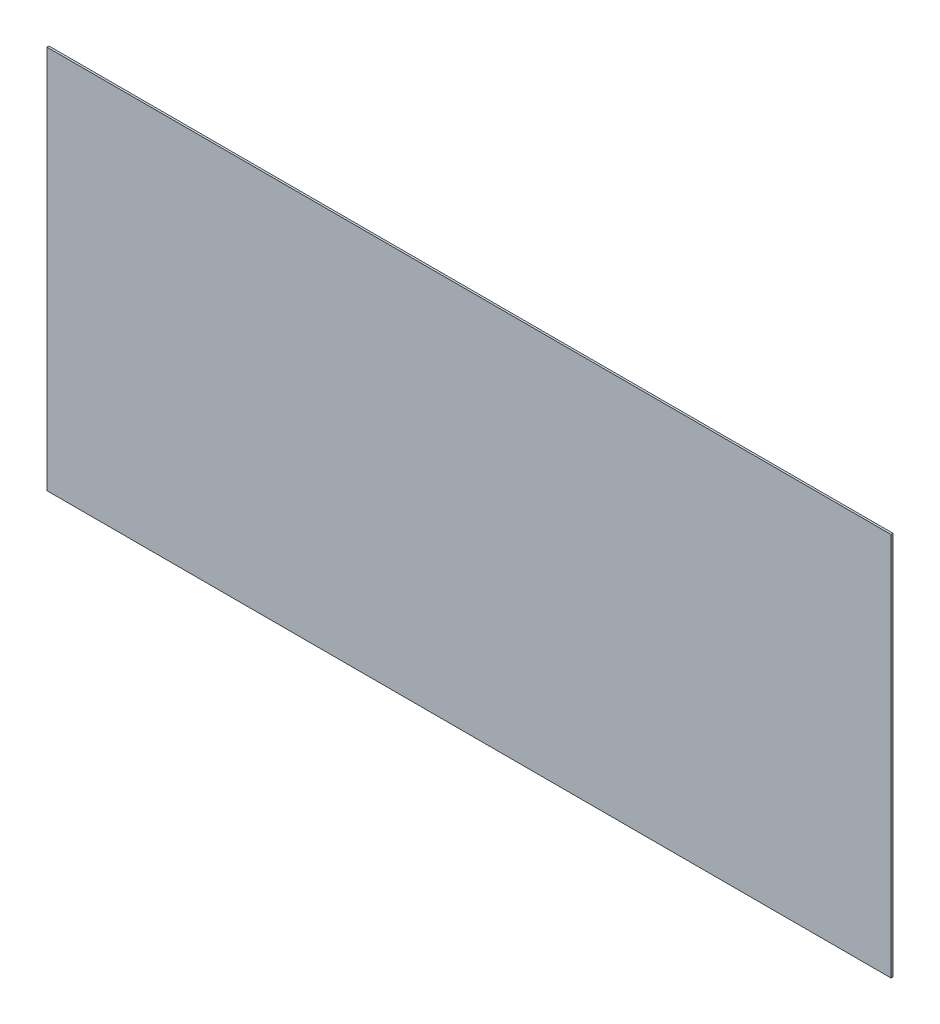
ISO-10303-21;
HEADER;
FILE_DESCRIPTION(('STEP AP214'),'2;1');
FILE_NAME('part.step','',(''),(''),'','','');
FILE_SCHEMA(('AUTOMOTIVE_DESIGN { 1 0 10303 214 1 1 1 1 }'));
ENDSEC;
DATA;
#1=APPLICATION_CONTEXT('core data for automotive mechanical design processes');
#2=APPLICATION_PROTOCOL_DEFINITION('international standard','automotive_design',2000,#1);
#3=PRODUCT_CONTEXT('',#1,'mechanical');
#4=PRODUCT('Part','Part','',(#3));
#5=PRODUCT_RELATED_PRODUCT_CATEGORY('part','',(#4));
#6=PRODUCT_DEFINITION_FORMATION('','',#4);
#7=PRODUCT_DEFINITION_CONTEXT('part definition',#1,'design');
#8=PRODUCT_DEFINITION('design','',#6,#7);
#9=PRODUCT_DEFINITION_SHAPE('','',#8);
#10=(LENGTH_UNIT() NAMED_UNIT(*) SI_UNIT(.MILLI.,.METRE.));
#11=(NAMED_UNIT(*) PLANE_ANGLE_UNIT() SI_UNIT($,.RADIAN.));
#12=(NAMED_UNIT(*) SI_UNIT($,.STERADIAN.) SOLID_ANGLE_UNIT());
#13=UNCERTAINTY_MEASURE_WITH_UNIT(LENGTH_MEASURE(1.E-05),#10,'distance_accuracy_value','');
#14=(GEOMETRIC_REPRESENTATION_CONTEXT(3) GLOBAL_UNCERTAINTY_ASSIGNED_CONTEXT((#13)) GLOBAL_UNIT_ASSIGNED_CONTEXT((#10,
#11,#12)) REPRESENTATION_CONTEXT('',''));
#15=CARTESIAN_POINT('',(0.,0.,0.));
#16=DIRECTION('',(0.,0.,1.));
#17=DIRECTION('',(1.,0.,0.));
#18=AXIS2_PLACEMENT_3D('',#15,#16,#17);
#19=CARTESIAN_POINT('',(714.,403.,40.));
#20=DIRECTION('',(1.,0.,0.));
#21=DIRECTION('',(0.,0.,-1.));
#22=AXIS2_PLACEMENT_3D('',#19,#20,#21);
#23=PLANE('',#22);
#24=DIRECTION('',(0.,-1.,0.));
#25=VECTOR('',#24,1.);
#26=CARTESIAN_POINT('',(714.,403.,38.5));
#27=LINE('',#26,#25);
#28=CARTESIAN_POINT('',(714.,687.,38.5));
#29=VERTEX_POINT('',#28);
#30=CARTESIAN_POINT('',(714.,403.,38.5));
#31=VERTEX_POINT('',#30);
#32=EDGE_CURVE('E102',#29,#31,#27,.T.);
#33=ORIENTED_EDGE('',*,*,#32,.T.);
#34=DIRECTION('',(0.,0.,-1.));
#35=VECTOR('',#34,1.);
#36=CARTESIAN_POINT('',(714.,403.,40.));
#37=LINE('',#36,#35);
#38=CARTESIAN_POINT('',(714.,403.,40.));
#39=VERTEX_POINT('',#38);
#40=EDGE_CURVE('E11',#39,#31,#37,.T.);
#41=ORIENTED_EDGE('',*,*,#40,.F.);
#42=DIRECTION('',(0.,-1.,0.));
#43=VECTOR('',#42,1.);
#44=CARTESIAN_POINT('',(714.,403.,40.));
#45=LINE('',#44,#43);
#46=CARTESIAN_POINT('',(714.,687.,40.));
#47=VERTEX_POINT('',#46);
#48=EDGE_CURVE('E90',#47,#39,#45,.T.);
#49=ORIENTED_EDGE('',*,*,#48,.F.);
#50=DIRECTION('',(0.,0.,-1.));
#51=VECTOR('',#50,1.);
#52=CARTESIAN_POINT('',(714.,687.,40.));
#53=LINE('',#52,#51);
#54=EDGE_CURVE('E98',#47,#29,#53,.T.);
#55=ORIENTED_EDGE('',*,*,#54,.T.);
#56=EDGE_LOOP('',(#33,#41,#49,#55));
#57=FACE_BOUND('',#56,.T.);
#58=ADVANCED_FACE('F39',(#57),#23,.F.);
#59=CARTESIAN_POINT('',(714.,403.,40.));
#60=DIRECTION('',(0.,1.,0.));
#61=DIRECTION('',(0.,0.,1.));
#62=AXIS2_PLACEMENT_3D('',#59,#60,#61);
#63=PLANE('',#62);
#64=DIRECTION('',(1.,0.,0.));
#65=VECTOR('',#64,1.);
#66=CARTESIAN_POINT('',(714.,403.,38.5));
#67=LINE('',#66,#65);
#68=CARTESIAN_POINT('',(1338.,403.,38.5));
#69=VERTEX_POINT('',#68);
#70=EDGE_CURVE('E94',#31,#69,#67,.T.);
#71=ORIENTED_EDGE('',*,*,#70,.T.);
#72=DIRECTION('',(0.,0.,-1.));
#73=VECTOR('',#72,1.);
#74=CARTESIAN_POINT('',(1338.,403.,40.));
#75=LINE('',#74,#73);
#76=CARTESIAN_POINT('',(1338.,403.,40.));
#77=VERTEX_POINT('',#76);
#78=EDGE_CURVE('E47',#77,#69,#75,.T.);
#79=ORIENTED_EDGE('',*,*,#78,.F.);
#80=DIRECTION('',(1.,0.,0.));
#81=VECTOR('',#80,1.);
#82=CARTESIAN_POINT('',(714.,403.,40.));
#83=LINE('',#82,#81);
#84=EDGE_CURVE('E85',#39,#77,#83,.T.);
#85=ORIENTED_EDGE('',*,*,#84,.F.);
#86=ORIENTED_EDGE('',*,*,#40,.T.);
#87=EDGE_LOOP('',(#71,#79,#85,#86));
#88=FACE_BOUND('',#87,.T.);
#89=ADVANCED_FACE('F93',(#88),#63,.F.);
#90=CARTESIAN_POINT('',(1338.,403.,40.));
#91=DIRECTION('',(-1.,0.,0.));
#92=DIRECTION('',(0.,0.,1.));
#93=AXIS2_PLACEMENT_3D('',#90,#91,#92);
#94=PLANE('',#93);
#95=DIRECTION('',(0.,1.,0.));
#96=VECTOR('',#95,1.);
#97=CARTESIAN_POINT('',(1338.,403.,38.5));
#98=LINE('',#97,#96);
#99=CARTESIAN_POINT('',(1338.,687.,38.5));
#100=VERTEX_POINT('',#99);
#101=EDGE_CURVE('E72',#69,#100,#98,.T.);
#102=ORIENTED_EDGE('',*,*,#101,.T.);
#103=DIRECTION('',(0.,0.,-1.));
#104=VECTOR('',#103,1.);
#105=CARTESIAN_POINT('',(1338.,687.,40.));
#106=LINE('',#105,#104);
#107=CARTESIAN_POINT('',(1338.,687.,40.));
#108=VERTEX_POINT('',#107);
#109=EDGE_CURVE('E95',#108,#100,#106,.T.);
#110=ORIENTED_EDGE('',*,*,#109,.F.);
#111=DIRECTION('',(0.,1.,0.));
#112=VECTOR('',#111,1.);
#113=CARTESIAN_POINT('',(1338.,403.,40.));
#114=LINE('',#113,#112);
#115=EDGE_CURVE('E88',#77,#108,#114,.T.);
#116=ORIENTED_EDGE('',*,*,#115,.F.);
#117=ORIENTED_EDGE('',*,*,#78,.T.);
#118=EDGE_LOOP('',(#102,#110,#116,#117));
#119=FACE_BOUND('',#118,.T.);
#120=ADVANCED_FACE('F96',(#119),#94,.F.);
#121=CARTESIAN_POINT('',(714.,687.,40.));
#122=DIRECTION('',(0.,-1.,0.));
#123=DIRECTION('',(0.,0.,-1.));
#124=AXIS2_PLACEMENT_3D('',#121,#122,#123);
#125=PLANE('',#124);
#126=DIRECTION('',(-1.,0.,0.));
#127=VECTOR('',#126,1.);
#128=CARTESIAN_POINT('',(714.,687.,38.5));
#129=LINE('',#128,#127);
#130=EDGE_CURVE('E78',#100,#29,#129,.T.);
#131=ORIENTED_EDGE('',*,*,#130,.T.);
#132=ORIENTED_EDGE('',*,*,#54,.F.);
#133=DIRECTION('',(-1.,0.,0.));
#134=VECTOR('',#133,1.);
#135=CARTESIAN_POINT('',(714.,687.,40.));
#136=LINE('',#135,#134);
#137=EDGE_CURVE('E55',#108,#47,#136,.T.);
#138=ORIENTED_EDGE('',*,*,#137,.F.);
#139=ORIENTED_EDGE('',*,*,#109,.T.);
#140=EDGE_LOOP('',(#131,#132,#138,#139));
#141=FACE_BOUND('',#140,.T.);
#142=ADVANCED_FACE('F109',(#141),#125,.F.);
#143=CARTESIAN_POINT('',(0.,0.,40.));
#144=DIRECTION('',(0.,0.,-1.));
#145=DIRECTION('',(-1.,0.,0.));
#146=AXIS2_PLACEMENT_3D('',#143,#144,#145);
#147=PLANE('',#146);
#148=ORIENTED_EDGE('',*,*,#48,.T.);
#149=ORIENTED_EDGE('',*,*,#84,.T.);
#150=ORIENTED_EDGE('',*,*,#115,.T.);
#151=ORIENTED_EDGE('',*,*,#137,.T.);
#152=EDGE_LOOP('',(#148,#149,#150,#151));
#153=FACE_BOUND('',#152,.T.);
#154=ADVANCED_FACE('F86',(#153),#147,.F.);
#155=CARTESIAN_POINT('',(0.,0.,38.5));
#156=DIRECTION('',(0.,0.,-1.));
#157=DIRECTION('',(-1.,0.,0.));
#158=AXIS2_PLACEMENT_3D('',#155,#156,#157);
#159=PLANE('',#158);
#160=ORIENTED_EDGE('',*,*,#32,.F.);
#161=ORIENTED_EDGE('',*,*,#130,.F.);
#162=ORIENTED_EDGE('',*,*,#101,.F.);
#163=ORIENTED_EDGE('',*,*,#70,.F.);
#164=EDGE_LOOP('',(#160,#161,#162,#163));
#165=FACE_BOUND('',#164,.T.);
#166=ADVANCED_FACE('F112',(#165),#159,.T.);
#167=CLOSED_SHELL('',(#58,#89,#120,#142,#154,#166));
#168=MANIFOLD_SOLID_BREP('B2',#167);
#169=ADVANCED_BREP_SHAPE_REPRESENTATION('',(#18,#168),#14);
#170=SHAPE_DEFINITION_REPRESENTATION(#9,#169);
ENDSEC;
END-ISO-10303-21;
